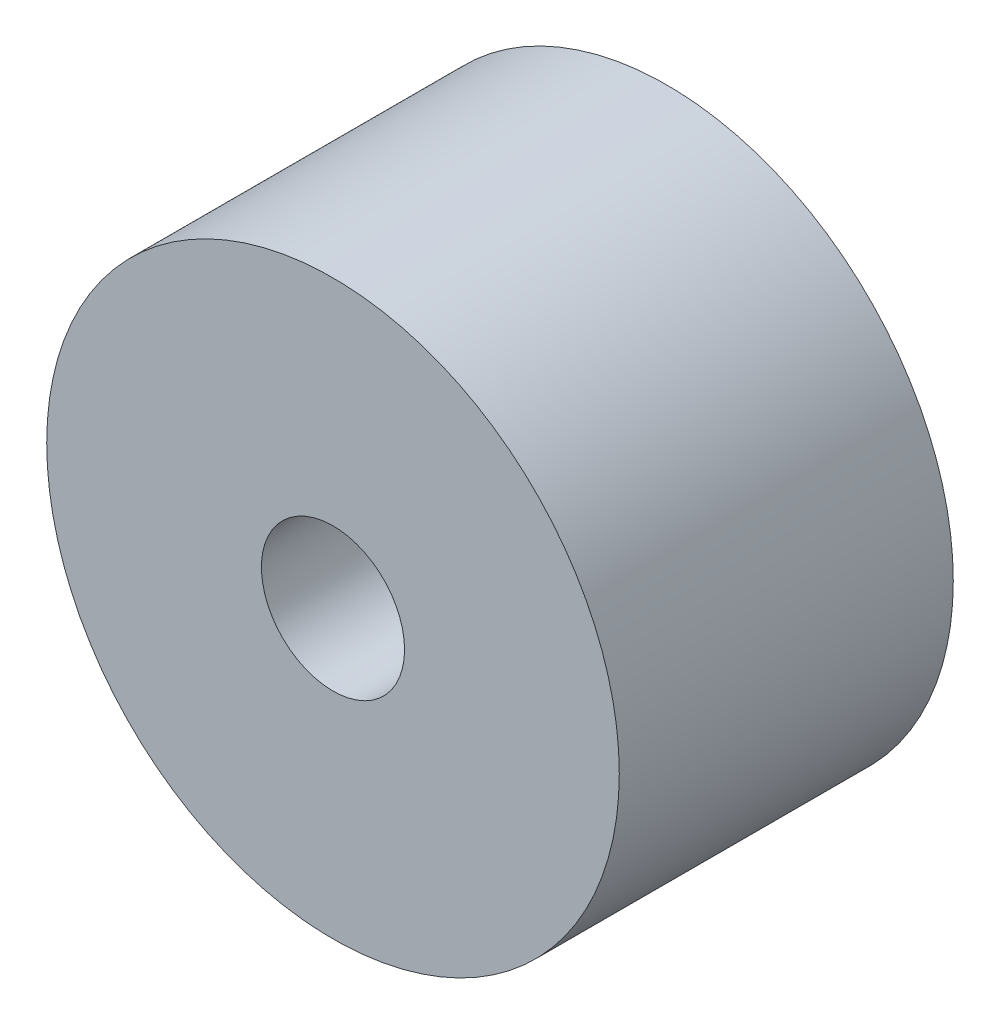
ISO-10303-21;
HEADER;
FILE_DESCRIPTION(('STEP AP214'),'2;1');
FILE_NAME('part.step','',(''),(''),'','','');
FILE_SCHEMA(('AUTOMOTIVE_DESIGN { 1 0 10303 214 1 1 1 1 }'));
ENDSEC;
DATA;
#1=APPLICATION_CONTEXT('core data for automotive mechanical design processes');
#2=APPLICATION_PROTOCOL_DEFINITION('international standard','automotive_design',2000,#1);
#3=PRODUCT_CONTEXT('',#1,'mechanical');
#4=PRODUCT('Part','Part','',(#3));
#5=PRODUCT_RELATED_PRODUCT_CATEGORY('part','',(#4));
#6=PRODUCT_DEFINITION_FORMATION('','',#4);
#7=PRODUCT_DEFINITION_CONTEXT('part definition',#1,'design');
#8=PRODUCT_DEFINITION('design','',#6,#7);
#9=PRODUCT_DEFINITION_SHAPE('','',#8);
#10=(LENGTH_UNIT() NAMED_UNIT(*) SI_UNIT(.MILLI.,.METRE.));
#11=(NAMED_UNIT(*) PLANE_ANGLE_UNIT() SI_UNIT($,.RADIAN.));
#12=(NAMED_UNIT(*) SI_UNIT($,.STERADIAN.) SOLID_ANGLE_UNIT());
#13=UNCERTAINTY_MEASURE_WITH_UNIT(LENGTH_MEASURE(1.E-05),#10,'distance_accuracy_value','');
#14=(GEOMETRIC_REPRESENTATION_CONTEXT(3) GLOBAL_UNCERTAINTY_ASSIGNED_CONTEXT((#13)) GLOBAL_UNIT_ASSIGNED_CONTEXT((#10,
#11,#12)) REPRESENTATION_CONTEXT('',''));
#15=CARTESIAN_POINT('',(0.,0.,0.));
#16=DIRECTION('',(0.,0.,1.));
#17=DIRECTION('',(1.,0.,0.));
#18=AXIS2_PLACEMENT_3D('',#15,#16,#17);
#19=CARTESIAN_POINT('',(2.08425656763246,-0.00200455213729739,3.5));
#20=DIRECTION('',(0.,0.,1.));
#21=DIRECTION('',(1.,0.,0.));
#22=AXIS2_PLACEMENT_3D('',#19,#20,#21);
#23=PLANE('',#22);
#24=CARTESIAN_POINT('',(3.90798504668055E-13,-1.73477898712804E-12,3.5));
#25=DIRECTION('',(0.,0.,1.));
#26=DIRECTION('',(1.,0.,0.));
#27=AXIS2_PLACEMENT_3D('',#24,#25,#26);
#28=CIRCLE('',#27,2.99999999999843);
#29=CARTESIAN_POINT('',(2.99999999999883,-1.73477898712804E-12,3.5));
#30=VERTEX_POINT('',#29);
#31=EDGE_CURVE('E10',#30,#30,#28,.T.);
#32=ORIENTED_EDGE('',*,*,#31,.T.);
#33=EDGE_LOOP('',(#32));
#34=FACE_BOUND('',#33,.T.);
#35=CARTESIAN_POINT('',(3.90798504668055E-13,-1.73477898712804E-12,3.5));
#36=DIRECTION('',(0.,0.,1.));
#37=DIRECTION('',(1.,0.,0.));
#38=AXIS2_PLACEMENT_3D('',#35,#36,#37);
#39=CIRCLE('',#38,0.75);
#40=CARTESIAN_POINT('',(0.750000000000391,-1.73477898712804E-12,3.5));
#41=VERTEX_POINT('',#40);
#42=EDGE_CURVE('E42',#41,#41,#39,.T.);
#43=ORIENTED_EDGE('',*,*,#42,.F.);
#44=EDGE_LOOP('',(#43));
#45=FACE_BOUND('',#44,.T.);
#46=ADVANCED_FACE('F31',(#34,#45),#23,.T.);
#47=CARTESIAN_POINT('',(2.08425656763246,-0.00200455213729739,0.));
#48=DIRECTION('',(0.,0.,1.));
#49=DIRECTION('',(1.,0.,0.));
#50=AXIS2_PLACEMENT_3D('',#47,#48,#49);
#51=PLANE('',#50);
#52=CARTESIAN_POINT('',(3.90798504668055E-13,-1.73477898712804E-12,0.));
#53=DIRECTION('',(0.,0.,1.));
#54=DIRECTION('',(1.,0.,0.));
#55=AXIS2_PLACEMENT_3D('',#52,#53,#54);
#56=CIRCLE('',#55,2.99999999999897);
#57=CARTESIAN_POINT('',(2.99999999999936,-1.73477898712804E-12,0.));
#58=VERTEX_POINT('',#57);
#59=EDGE_CURVE('E35',#58,#58,#56,.T.);
#60=ORIENTED_EDGE('',*,*,#59,.F.);
#61=EDGE_LOOP('',(#60));
#62=FACE_BOUND('',#61,.T.);
#63=CARTESIAN_POINT('',(3.90798504668055E-13,-1.73477898712804E-12,0.));
#64=DIRECTION('',(0.,0.,1.));
#65=DIRECTION('',(1.,0.,0.));
#66=AXIS2_PLACEMENT_3D('',#63,#64,#65);
#67=CIRCLE('',#66,0.75);
#68=CARTESIAN_POINT('',(0.750000000000391,-1.73477898712804E-12,0.));
#69=VERTEX_POINT('',#68);
#70=EDGE_CURVE('E44',#69,#69,#67,.T.);
#71=ORIENTED_EDGE('',*,*,#70,.T.);
#72=EDGE_LOOP('',(#71));
#73=FACE_BOUND('',#72,.T.);
#74=ADVANCED_FACE('F54',(#62,#73),#51,.F.);
#75=CARTESIAN_POINT('',(3.90798504668055E-13,-1.73477898712804E-12,3.5));
#76=DIRECTION('',(0.,0.,-1.));
#77=DIRECTION('',(-1.,0.,0.));
#78=AXIS2_PLACEMENT_3D('',#75,#76,#77);
#79=CYLINDRICAL_SURFACE('',#78,2.99999999999897);
#80=ORIENTED_EDGE('',*,*,#59,.T.);
#81=EDGE_LOOP('',(#80));
#82=FACE_BOUND('',#81,.T.);
#83=ORIENTED_EDGE('',*,*,#31,.F.);
#84=EDGE_LOOP('',(#83));
#85=FACE_BOUND('',#84,.T.);
#86=ADVANCED_FACE('F33',(#82,#85),#79,.T.);
#87=CARTESIAN_POINT('',(3.90798504668055E-13,-1.73477898712804E-12,3.5));
#88=DIRECTION('',(0.,0.,-1.));
#89=DIRECTION('',(-1.,0.,0.));
#90=AXIS2_PLACEMENT_3D('',#87,#88,#89);
#91=CYLINDRICAL_SURFACE('',#90,0.75);
#92=ORIENTED_EDGE('',*,*,#42,.T.);
#93=EDGE_LOOP('',(#92));
#94=FACE_BOUND('',#93,.T.);
#95=ORIENTED_EDGE('',*,*,#70,.F.);
#96=EDGE_LOOP('',(#95));
#97=FACE_BOUND('',#96,.T.);
#98=ADVANCED_FACE('F50',(#94,#97),#91,.F.);
#99=CLOSED_SHELL('',(#46,#74,#86,#98));
#100=MANIFOLD_SOLID_BREP('B2',#99);
#101=ADVANCED_BREP_SHAPE_REPRESENTATION('',(#18,#100),#14);
#102=SHAPE_DEFINITION_REPRESENTATION(#9,#101);
ENDSEC;
END-ISO-10303-21;
